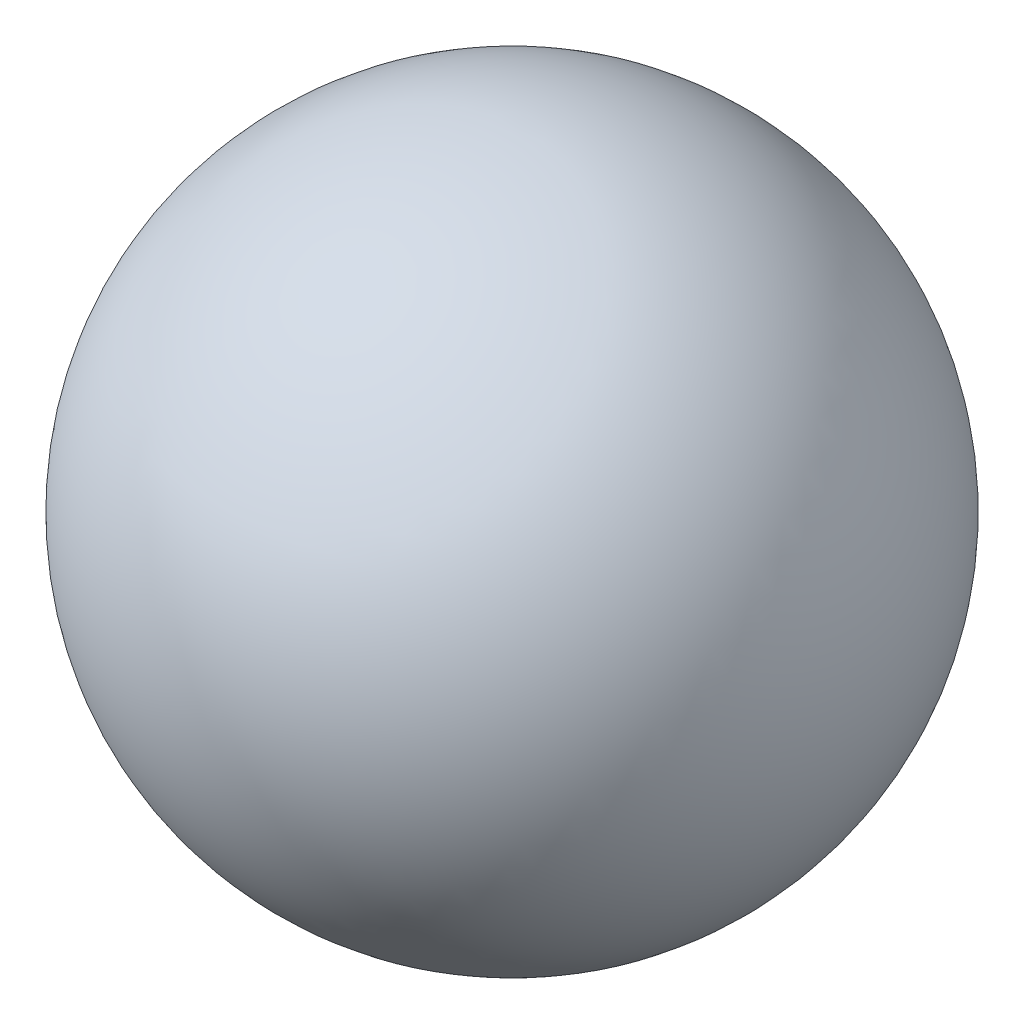
ISO-10303-21;
HEADER;
FILE_DESCRIPTION(('STEP AP214'),'2;1');
FILE_NAME('part.step','',(''),(''),'','','');
FILE_SCHEMA(('AUTOMOTIVE_DESIGN { 1 0 10303 214 1 1 1 1 }'));
ENDSEC;
DATA;
#1=APPLICATION_CONTEXT('core data for automotive mechanical design processes');
#2=APPLICATION_PROTOCOL_DEFINITION('international standard','automotive_design',2000,#1);
#3=PRODUCT_CONTEXT('',#1,'mechanical');
#4=PRODUCT('Part','Part','',(#3));
#5=PRODUCT_RELATED_PRODUCT_CATEGORY('part','',(#4));
#6=PRODUCT_DEFINITION_FORMATION('','',#4);
#7=PRODUCT_DEFINITION_CONTEXT('part definition',#1,'design');
#8=PRODUCT_DEFINITION('design','',#6,#7);
#9=PRODUCT_DEFINITION_SHAPE('','',#8);
#10=(LENGTH_UNIT() NAMED_UNIT(*) SI_UNIT(.MILLI.,.METRE.));
#11=(NAMED_UNIT(*) PLANE_ANGLE_UNIT() SI_UNIT($,.RADIAN.));
#12=(NAMED_UNIT(*) SI_UNIT($,.STERADIAN.) SOLID_ANGLE_UNIT());
#13=UNCERTAINTY_MEASURE_WITH_UNIT(LENGTH_MEASURE(1.E-05),#10,'distance_accuracy_value','');
#14=(GEOMETRIC_REPRESENTATION_CONTEXT(3) GLOBAL_UNCERTAINTY_ASSIGNED_CONTEXT((#13)) GLOBAL_UNIT_ASSIGNED_CONTEXT((#10,
#11,#12)) REPRESENTATION_CONTEXT('',''));
#15=CARTESIAN_POINT('',(0.,0.,0.));
#16=DIRECTION('',(0.,0.,1.));
#17=DIRECTION('',(1.,0.,0.));
#18=AXIS2_PLACEMENT_3D('',#15,#16,#17);
#19=CARTESIAN_POINT('',(0.,0.,0.));
#20=DIRECTION('',(0.,1.,0.));
#21=DIRECTION('',(1.,0.,0.));
#22=AXIS2_PLACEMENT_3D('',#19,#20,#21);
#23=SPHERICAL_SURFACE('',#22,3.5);
#24=CARTESIAN_POINT('',(0.,3.5,0.));
#25=VERTEX_POINT('',#24);
#26=VERTEX_LOOP('',#25);
#27=FACE_BOUND('',#26,.T.);
#28=ADVANCED_FACE('F29',(#27),#23,.T.);
#29=CLOSED_SHELL('',(#28));
#30=MANIFOLD_SOLID_BREP('B2',#29);
#31=ADVANCED_BREP_SHAPE_REPRESENTATION('',(#18,#30),#14);
#32=SHAPE_DEFINITION_REPRESENTATION(#9,#31);
ENDSEC;
END-ISO-10303-21;
